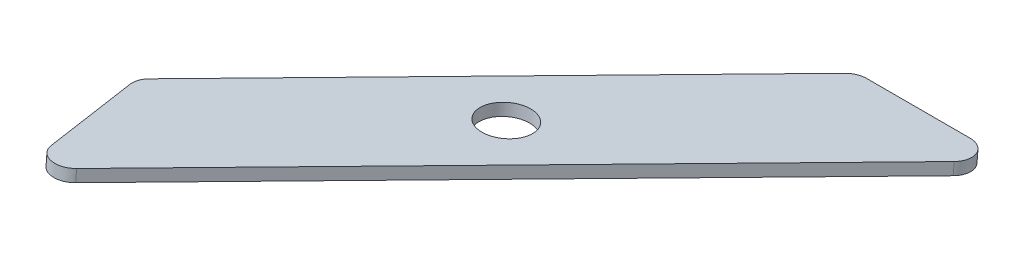
ISO-10303-21;
HEADER;
FILE_DESCRIPTION(('STEP AP214'),'2;1');
FILE_NAME('part.step','',(''),(''),'','','');
FILE_SCHEMA(('AUTOMOTIVE_DESIGN { 1 0 10303 214 1 1 1 1 }'));
ENDSEC;
DATA;
#1=APPLICATION_CONTEXT('core data for automotive mechanical design processes');
#2=APPLICATION_PROTOCOL_DEFINITION('international standard','automotive_design',2000,#1);
#3=PRODUCT_CONTEXT('',#1,'mechanical');
#4=PRODUCT('Part','Part','',(#3));
#5=PRODUCT_RELATED_PRODUCT_CATEGORY('part','',(#4));
#6=PRODUCT_DEFINITION_FORMATION('','',#4);
#7=PRODUCT_DEFINITION_CONTEXT('part definition',#1,'design');
#8=PRODUCT_DEFINITION('design','',#6,#7);
#9=PRODUCT_DEFINITION_SHAPE('','',#8);
#10=(LENGTH_UNIT() NAMED_UNIT(*) SI_UNIT(.MILLI.,.METRE.));
#11=(NAMED_UNIT(*) PLANE_ANGLE_UNIT() SI_UNIT($,.RADIAN.));
#12=(NAMED_UNIT(*) SI_UNIT($,.STERADIAN.) SOLID_ANGLE_UNIT());
#13=UNCERTAINTY_MEASURE_WITH_UNIT(LENGTH_MEASURE(1.E-05),#10,'distance_accuracy_value','');
#14=(GEOMETRIC_REPRESENTATION_CONTEXT(3) GLOBAL_UNCERTAINTY_ASSIGNED_CONTEXT((#13)) GLOBAL_UNIT_ASSIGNED_CONTEXT((#10,
#11,#12)) REPRESENTATION_CONTEXT('',''));
#15=CARTESIAN_POINT('',(0.,0.,0.));
#16=DIRECTION('',(0.,0.,1.));
#17=DIRECTION('',(1.,0.,0.));
#18=AXIS2_PLACEMENT_3D('',#15,#16,#17);
#19=CARTESIAN_POINT('',(-7.13645297293957E-13,53.778197883597,-4.47708887821372));
#20=DIRECTION('',(0.,0.996552545023082,-0.0829639982644206));
#21=DIRECTION('',(0.,0.0829639982644207,0.996552545023082));
#22=AXIS2_PLACEMENT_3D('',#19,#20,#21);
#23=PLANE('',#22);
#24=DIRECTION('',(0.62740953579409,-0.0646031909695749,-0.776004962684642));
#25=VECTOR('',#24,1.);
#26=CARTESIAN_POINT('',(-319.072942794247,61.1309245679556,83.8428889850427));
#27=LINE('',#26,#25);
#28=CARTESIAN_POINT('',(-318.31042098198,61.0524091176063,82.8997718076391));
#29=VERTEX_POINT('',#28);
#30=CARTESIAN_POINT('',(-276.697051927991,56.7675580362792,31.4307088469496));
#31=VERTEX_POINT('',#30);
#32=EDGE_CURVE('E141',#29,#31,#27,.T.);
#33=ORIENTED_EDGE('',*,*,#32,.T.);
#34=CARTESIAN_POINT('',(-274.719180700766,56.8997711415215,33.0188351339046));
#35=DIRECTION('',(0.,0.996552545023082,-0.0829639982644206));
#36=DIRECTION('',(0.,0.0829639982644207,0.996552545023082));
#37=AXIS2_PLACEMENT_3D('',#34,#35,#36);
#38=CIRCLE('',#37,2.54);
#39=CARTESIAN_POINT('',(-274.719180700766,56.6890425859299,30.487591669546));
#40=VERTEX_POINT('',#39);
#41=EDGE_CURVE('E160',#31,#40,#38,.F.);
#42=ORIENTED_EDGE('',*,*,#41,.T.);
#43=DIRECTION('',(1.,0.,0.));
#44=VECTOR('',#43,1.);
#45=CARTESIAN_POINT('',(-275.934530115724,56.6890425859298,30.487591669546));
#46=LINE('',#45,#44);
#47=CARTESIAN_POINT('',(-260.856144714105,56.68904258593,30.487591669546));
#48=VERTEX_POINT('',#47);
#49=EDGE_CURVE('E124',#40,#48,#46,.T.);
#50=ORIENTED_EDGE('',*,*,#49,.T.);
#51=CARTESIAN_POINT('',(-260.856144714105,56.8997711415217,33.0188351339046));
#52=DIRECTION('',(0.,0.996552545023082,-0.0829639982644206));
#53=DIRECTION('',(0.,0.0829639982644207,0.996552545023082));
#54=AXIS2_PLACEMENT_3D('',#51,#52,#53);
#55=CIRCLE('',#54,2.54);
#56=CARTESIAN_POINT('',(-258.878273486881,57.031984246764,34.6069614208597));
#57=VERTEX_POINT('',#56);
#58=EDGE_CURVE('E158',#48,#57,#55,.F.);
#59=ORIENTED_EDGE('',*,*,#58,.T.);
#60=DIRECTION('',(-0.627409535794091,0.0646031909695749,0.776004962684641));
#61=VECTOR('',#60,1.);
#62=CARTESIAN_POINT('',(-255.547712488283,56.6890425859301,30.4875916695459));
#63=LINE('',#62,#61);
#64=CARTESIAN_POINT('',(-311.405809082778,62.4406467226506,99.5750978206675));
#65=VERTEX_POINT('',#64);
#66=EDGE_CURVE('E180',#57,#65,#63,.T.);
#67=ORIENTED_EDGE('',*,*,#66,.T.);
#68=CARTESIAN_POINT('',(-313.383680310003,62.3084336174082,97.9869715337124));
#69=DIRECTION('',(0.,0.996552545023082,-0.0829639982644206));
#70=DIRECTION('',(0.,0.0829639982644207,0.996552545023082));
#71=AXIS2_PLACEMENT_3D('',#68,#69,#70);
#72=CIRCLE('',#71,2.54);
#73=CARTESIAN_POINT('',(-315.86555084707,62.3532586470279,98.5254038451092));
#74=VERTEX_POINT('',#73);
#75=EDGE_CURVE('E59',#65,#74,#72,.F.);
#76=ORIENTED_EDGE('',*,*,#75,.T.);
#77=DIRECTION('',(-0.212714548789279,-0.0810653161140894,-0.973745826823764));
#78=VECTOR('',#77,1.);
#79=CARTESIAN_POINT('',(-314.736370081376,62.7835883834845,103.694467571981));
#80=LINE('',#79,#78);
#81=CARTESIAN_POINT('',(-318.814420291822,61.2294472524683,85.0263304059911));
#82=VERTEX_POINT('',#81);
#83=EDGE_CURVE('E170',#74,#82,#80,.T.);
#84=ORIENTED_EDGE('',*,*,#83,.T.);
#85=CARTESIAN_POINT('',(-316.332549754755,61.1846222228486,84.4878980945942));
#86=DIRECTION('',(0.,0.996552545023082,-0.0829639982644206));
#87=DIRECTION('',(0.,0.0829639982644207,0.996552545023082));
#88=AXIS2_PLACEMENT_3D('',#85,#86,#87);
#89=CIRCLE('',#88,2.54);
#90=EDGE_CURVE('E156',#82,#29,#89,.F.);
#91=ORIENTED_EDGE('',*,*,#90,.T.);
#92=EDGE_LOOP('',(#33,#42,#50,#59,#67,#76,#84,#91));
#93=FACE_BOUND('',#92,.T.);
#94=CARTESIAN_POINT('',(-291.322888869907,59.323149530825,62.1281349740289));
#95=DIRECTION('',(0.,-0.996552545023082,0.0829639982644206));
#96=DIRECTION('',(0.,-0.0829639982644206,-0.996552545023082));
#97=AXIS2_PLACEMENT_3D('',#94,#95,#96);
#98=CIRCLE('',#97,3.26390000000006);
#99=CARTESIAN_POINT('',(-291.322888869907,59.5939357247602,65.3807828257298));
#100=VERTEX_POINT('',#99);
#101=EDGE_CURVE('E132',#100,#100,#98,.T.);
#102=ORIENTED_EDGE('',*,*,#101,.F.);
#103=EDGE_LOOP('',(#102));
#104=FACE_BOUND('',#103,.T.);
#105=ADVANCED_FACE('F39',(#93,#104),#23,.F.);
#106=CARTESIAN_POINT('',(-7.34839107889356E-13,55.3602250488212,-4.60879422545849));
#107=DIRECTION('',(0.,0.996552545023082,-0.0829639982644206));
#108=DIRECTION('',(0.,0.0829639982644207,0.996552545023082));
#109=AXIS2_PLACEMENT_3D('',#106,#107,#108);
#110=PLANE('',#109);
#111=DIRECTION('',(1.,0.,0.));
#112=VECTOR('',#111,1.);
#113=CARTESIAN_POINT('',(-275.934530115724,58.271069751154,30.3558863223013));
#114=LINE('',#113,#112);
#115=CARTESIAN_POINT('',(-274.719180700766,58.271069751154,30.3558863223012));
#116=VERTEX_POINT('',#115);
#117=CARTESIAN_POINT('',(-260.856144714105,58.2710697511542,30.3558863223012));
#118=VERTEX_POINT('',#117);
#119=EDGE_CURVE('E121',#116,#118,#114,.T.);
#120=ORIENTED_EDGE('',*,*,#119,.F.);
#121=CARTESIAN_POINT('',(-274.719180700766,58.4817983067456,32.8871297866599));
#122=DIRECTION('',(0.,0.996552545023082,-0.0829639982644206));
#123=DIRECTION('',(0.,0.0829639982644207,0.996552545023082));
#124=AXIS2_PLACEMENT_3D('',#121,#122,#123);
#125=CIRCLE('',#124,2.54);
#126=CARTESIAN_POINT('',(-276.697051927991,58.3495852015033,31.2990034997048));
#127=VERTEX_POINT('',#126);
#128=EDGE_CURVE('E104',#116,#127,#125,.T.);
#129=ORIENTED_EDGE('',*,*,#128,.T.);
#130=DIRECTION('',(0.62740953579409,-0.0646031909695749,-0.776004962684642));
#131=VECTOR('',#130,1.);
#132=CARTESIAN_POINT('',(-319.072942794247,62.7129517331797,83.7111836377979));
#133=LINE('',#132,#131);
#134=CARTESIAN_POINT('',(-318.31042098198,62.6344362828304,82.7680664603944));
#135=VERTEX_POINT('',#134);
#136=EDGE_CURVE('E145',#135,#127,#133,.T.);
#137=ORIENTED_EDGE('',*,*,#136,.F.);
#138=CARTESIAN_POINT('',(-316.332549754755,62.7666493880728,84.3561927473495));
#139=DIRECTION('',(0.,0.996552545023082,-0.0829639982644206));
#140=DIRECTION('',(0.,0.0829639982644207,0.996552545023082));
#141=AXIS2_PLACEMENT_3D('',#138,#139,#140);
#142=CIRCLE('',#141,2.54);
#143=CARTESIAN_POINT('',(-318.814420291822,62.8114744176924,84.8946250587463));
#144=VERTEX_POINT('',#143);
#145=EDGE_CURVE('E149',#135,#144,#142,.T.);
#146=ORIENTED_EDGE('',*,*,#145,.T.);
#147=DIRECTION('',(-0.212714548789279,-0.0810653161140894,-0.973745826823764));
#148=VECTOR('',#147,1.);
#149=CARTESIAN_POINT('',(-314.736370081376,64.3656155487086,103.562762224736));
#150=LINE('',#149,#148);
#151=CARTESIAN_POINT('',(-315.86555084707,63.935285812252,98.3936984978645));
#152=VERTEX_POINT('',#151);
#153=EDGE_CURVE('E135',#152,#144,#150,.T.);
#154=ORIENTED_EDGE('',*,*,#153,.F.);
#155=CARTESIAN_POINT('',(-313.383680310003,63.8904607826324,97.8552661864676));
#156=DIRECTION('',(0.,0.996552545023082,-0.0829639982644206));
#157=DIRECTION('',(0.,0.0829639982644207,0.996552545023082));
#158=AXIS2_PLACEMENT_3D('',#155,#156,#157);
#159=CIRCLE('',#158,2.54);
#160=CARTESIAN_POINT('',(-311.405809082778,64.0226738878747,99.4433924734227));
#161=VERTEX_POINT('',#160);
#162=EDGE_CURVE('E125',#152,#161,#159,.T.);
#163=ORIENTED_EDGE('',*,*,#162,.T.);
#164=DIRECTION('',(-0.627409535794091,0.0646031909695749,0.776004962684641));
#165=VECTOR('',#164,1.);
#166=CARTESIAN_POINT('',(-255.547712488283,58.2710697511543,30.3558863223012));
#167=LINE('',#166,#165);
#168=CARTESIAN_POINT('',(-258.878273486881,58.6140114119881,34.4752560736149));
#169=VERTEX_POINT('',#168);
#170=EDGE_CURVE('E131',#169,#161,#167,.T.);
#171=ORIENTED_EDGE('',*,*,#170,.F.);
#172=CARTESIAN_POINT('',(-260.856144714105,58.4817983067458,32.8871297866598));
#173=DIRECTION('',(0.,0.996552545023082,-0.0829639982644206));
#174=DIRECTION('',(0.,0.0829639982644207,0.996552545023082));
#175=AXIS2_PLACEMENT_3D('',#172,#173,#174);
#176=CIRCLE('',#175,2.54);
#177=EDGE_CURVE('E115',#169,#118,#176,.T.);
#178=ORIENTED_EDGE('',*,*,#177,.T.);
#179=EDGE_LOOP('',(#120,#129,#137,#146,#154,#163,#171,#178));
#180=FACE_BOUND('',#179,.T.);
#181=CARTESIAN_POINT('',(-291.322888869907,60.9051766960491,61.9964296267842));
#182=DIRECTION('',(0.,-0.996552545023082,0.0829639982644206));
#183=DIRECTION('',(0.,-0.0829639982644206,-0.996552545023082));
#184=AXIS2_PLACEMENT_3D('',#181,#182,#183);
#185=CIRCLE('',#184,3.26390000000006);
#186=CARTESIAN_POINT('',(-291.322888869907,61.1759628899844,65.2490774784851));
#187=VERTEX_POINT('',#186);
#188=EDGE_CURVE('E138',#187,#187,#185,.T.);
#189=ORIENTED_EDGE('',*,*,#188,.T.);
#190=EDGE_LOOP('',(#189));
#191=FACE_BOUND('',#190,.T.);
#192=ADVANCED_FACE('F128',(#180,#191),#110,.T.);
#193=CARTESIAN_POINT('',(-275.934530115724,56.6890425859298,30.487591669546));
#194=DIRECTION('',(0.,0.0829639982644206,0.996552545023082));
#195=DIRECTION('',(0.,-0.996552545023082,0.0829639982644206));
#196=AXIS2_PLACEMENT_3D('',#193,#194,#195);
#197=PLANE('',#196);
#198=ORIENTED_EDGE('',*,*,#49,.F.);
#199=DIRECTION('',(0.,0.996552545023082,-0.0829639982644206));
#200=VECTOR('',#199,1.);
#201=CARTESIAN_POINT('',(-274.719180700766,56.6890425859299,30.487591669546));
#202=LINE('',#201,#200);
#203=EDGE_CURVE('E108',#40,#116,#202,.T.);
#204=ORIENTED_EDGE('',*,*,#203,.T.);
#205=ORIENTED_EDGE('',*,*,#119,.T.);
#206=DIRECTION('',(0.,0.996552545023082,-0.0829639982644206));
#207=VECTOR('',#206,1.);
#208=CARTESIAN_POINT('',(-260.856144714105,56.68904258593,30.487591669546));
#209=LINE('',#208,#207);
#210=EDGE_CURVE('E126',#118,#48,#209,.F.);
#211=ORIENTED_EDGE('',*,*,#210,.T.);
#212=EDGE_LOOP('',(#198,#204,#205,#211));
#213=FACE_BOUND('',#212,.T.);
#214=ADVANCED_FACE('F120',(#213),#197,.F.);
#215=CARTESIAN_POINT('',(-255.547712488283,56.6890425859301,30.4875916695459));
#216=DIRECTION('',(-0.778689459537397,-0.0520524036387122,-0.625246569667351));
#217=DIRECTION('',(-0.626095332830915,0.,0.779746519201815));
#218=AXIS2_PLACEMENT_3D('',#215,#216,#217);
#219=PLANE('',#218);
#220=ORIENTED_EDGE('',*,*,#66,.F.);
#221=DIRECTION('',(0.,0.996552545023082,-0.0829639982644206));
#222=VECTOR('',#221,1.);
#223=CARTESIAN_POINT('',(-258.878273486881,57.031984246764,34.6069614208597));
#224=LINE('',#223,#222);
#225=EDGE_CURVE('E164',#57,#169,#224,.T.);
#226=ORIENTED_EDGE('',*,*,#225,.T.);
#227=ORIENTED_EDGE('',*,*,#170,.T.);
#228=DIRECTION('',(0.,0.996552545023082,-0.0829639982644206));
#229=VECTOR('',#228,1.);
#230=CARTESIAN_POINT('',(-311.405809082778,62.4406467226506,99.5750978206675));
#231=LINE('',#230,#229);
#232=EDGE_CURVE('E162',#161,#65,#231,.F.);
#233=ORIENTED_EDGE('',*,*,#232,.T.);
#234=EDGE_LOOP('',(#220,#226,#227,#233));
#235=FACE_BOUND('',#234,.T.);
#236=ADVANCED_FACE('F208',(#235),#219,.F.);
#237=CARTESIAN_POINT('',(-314.736370081376,62.7835883834845,103.694467571981));
#238=DIRECTION('',(0.977114384672221,-0.0176476494565577,-0.211981224959394));
#239=DIRECTION('',(-0.212014242338459,0.,-0.977266576245013));
#240=AXIS2_PLACEMENT_3D('',#237,#238,#239);
#241=PLANE('',#240);
#242=ORIENTED_EDGE('',*,*,#153,.T.);
#243=DIRECTION('',(0.,0.996552545023082,-0.0829639982644206));
#244=VECTOR('',#243,1.);
#245=CARTESIAN_POINT('',(-318.814420291822,61.2294472524683,85.0263304059911));
#246=LINE('',#245,#244);
#247=EDGE_CURVE('E11',#144,#82,#246,.F.);
#248=ORIENTED_EDGE('',*,*,#247,.T.);
#249=ORIENTED_EDGE('',*,*,#83,.F.);
#250=DIRECTION('',(0.,0.996552545023082,-0.0829639982644206));
#251=VECTOR('',#250,1.);
#252=CARTESIAN_POINT('',(-315.86555084707,62.3532586470279,98.5254038451092));
#253=LINE('',#252,#251);
#254=EDGE_CURVE('E47',#74,#152,#253,.T.);
#255=ORIENTED_EDGE('',*,*,#254,.T.);
#256=EDGE_LOOP('',(#242,#248,#249,#255));
#257=FACE_BOUND('',#256,.T.);
#258=ADVANCED_FACE('F169',(#257),#241,.F.);
#259=CARTESIAN_POINT('',(-319.072942794247,61.1309245679556,83.8428889850427));
#260=DIRECTION('',(0.778689459537398,0.0520524036387122,0.62524656966735));
#261=DIRECTION('',(0.626095332830914,0.,-0.779746519201815));
#262=AXIS2_PLACEMENT_3D('',#259,#260,#261);
#263=PLANE('',#262);
#264=ORIENTED_EDGE('',*,*,#136,.T.);
#265=DIRECTION('',(0.,0.996552545023082,-0.0829639982644206));
#266=VECTOR('',#265,1.);
#267=CARTESIAN_POINT('',(-276.697051927991,56.7675580362792,31.4307088469496));
#268=LINE('',#267,#266);
#269=EDGE_CURVE('E109',#127,#31,#268,.F.);
#270=ORIENTED_EDGE('',*,*,#269,.T.);
#271=ORIENTED_EDGE('',*,*,#32,.F.);
#272=DIRECTION('',(0.,0.996552545023082,-0.0829639982644206));
#273=VECTOR('',#272,1.);
#274=CARTESIAN_POINT('',(-318.31042098198,61.0524091176063,82.8997718076391));
#275=LINE('',#274,#273);
#276=EDGE_CURVE('E114',#29,#135,#275,.T.);
#277=ORIENTED_EDGE('',*,*,#276,.T.);
#278=EDGE_LOOP('',(#264,#270,#271,#277));
#279=FACE_BOUND('',#278,.T.);
#280=ADVANCED_FACE('F178',(#279),#263,.F.);
#281=CARTESIAN_POINT('',(-291.322888869907,59.323149530825,62.1281349740289));
#282=DIRECTION('',(0.,0.996552545023082,-0.0829639982644206));
#283=DIRECTION('',(0.,0.0829639982644206,0.996552545023082));
#284=AXIS2_PLACEMENT_3D('',#281,#282,#283);
#285=CYLINDRICAL_SURFACE('',#284,3.26390000000006);
#286=CARTESIAN_POINT('',(-291.322888869907,59.5939357247602,65.3807828257298));
#287=CARTESIAN_POINT('',(-291.322888869907,59.610415174398,65.3794108950294));
#288=CARTESIAN_POINT('',(-291.322888869907,59.6268946240358,65.3780389643289));
#289=CARTESIAN_POINT('',(-291.322888869907,59.6598535233113,65.375295102928));
#290=CARTESIAN_POINT('',(-291.322888869907,59.676332972949,65.3739231722275));
#291=CARTESIAN_POINT('',(-291.322888869907,59.7092918722245,65.3711793108266));
#292=CARTESIAN_POINT('',(-291.322888869907,59.7257713218623,65.3698073801261));
#293=CARTESIAN_POINT('',(-291.322888869907,59.7587302211378,65.3670635187252));
#294=CARTESIAN_POINT('',(-291.322888869907,59.7752096707755,65.3656915880247));
#295=CARTESIAN_POINT('',(-291.322888869907,59.808168570051,65.3629477266238));
#296=CARTESIAN_POINT('',(-291.322888869907,59.8246480196888,65.3615757959233));
#297=CARTESIAN_POINT('',(-291.322888869907,59.8576069189643,65.3588319345224));
#298=CARTESIAN_POINT('',(-291.322888869907,59.874086368602,65.3574600038219));
#299=CARTESIAN_POINT('',(-291.322888869907,59.9070452678775,65.354716142421));
#300=CARTESIAN_POINT('',(-291.322888869907,59.9235247175153,65.3533442117205));
#301=CARTESIAN_POINT('',(-291.322888869907,59.9564836167908,65.3506003503196));
#302=CARTESIAN_POINT('',(-291.322888869907,59.9729630664285,65.3492284196191));
#303=CARTESIAN_POINT('',(-291.322888869907,60.005921965704,65.3464845582182));
#304=CARTESIAN_POINT('',(-291.322888869907,60.0224014153418,65.3451126275177));
#305=CARTESIAN_POINT('',(-291.322888869907,60.0553603146173,65.3423687661168));
#306=CARTESIAN_POINT('',(-291.322888869907,60.071839764255,65.3409968354163));
#307=CARTESIAN_POINT('',(-291.322888869907,60.1047986635305,65.3382529740154));
#308=CARTESIAN_POINT('',(-291.322888869907,60.1212781131683,65.3368810433149));
#309=CARTESIAN_POINT('',(-291.322888869907,60.1542370124438,65.334137181914));
#310=CARTESIAN_POINT('',(-291.322888869907,60.1707164620816,65.3327652512135));
#311=CARTESIAN_POINT('',(-291.322888869907,60.2036753613571,65.3300213898126));
#312=CARTESIAN_POINT('',(-291.322888869907,60.2201548109948,65.3286494591121));
#313=CARTESIAN_POINT('',(-291.322888869907,60.2531137102703,65.3259055977112));
#314=CARTESIAN_POINT('',(-291.322888869907,60.2695931599081,65.3245336670107));
#315=CARTESIAN_POINT('',(-291.322888869907,60.3025520591836,65.3217898056098));
#316=CARTESIAN_POINT('',(-291.322888869907,60.3190315088213,65.3204178749093));
#317=CARTESIAN_POINT('',(-291.322888869907,60.3519904080968,65.3176740135084));
#318=CARTESIAN_POINT('',(-291.322888869907,60.3684698577346,65.3163020828079));
#319=CARTESIAN_POINT('',(-291.322888869907,60.4014287570101,65.313558221407));
#320=CARTESIAN_POINT('',(-291.322888869907,60.4179082066478,65.3121862907065));
#321=CARTESIAN_POINT('',(-291.322888869907,60.4508671059233,65.3094424293056));
#322=CARTESIAN_POINT('',(-291.322888869907,60.4673465555611,65.3080704986051));
#323=CARTESIAN_POINT('',(-291.322888869907,60.5003054548366,65.3053266372042));
#324=CARTESIAN_POINT('',(-291.322888869907,60.5167849044743,65.3039547065037));
#325=CARTESIAN_POINT('',(-291.322888869907,60.5497438037498,65.3012108451028));
#326=CARTESIAN_POINT('',(-291.322888869907,60.5662232533876,65.2998389144023));
#327=CARTESIAN_POINT('',(-291.322888869907,60.5991821526631,65.2970950530014));
#328=CARTESIAN_POINT('',(-291.322888869907,60.6156616023008,65.2957231223009));
#329=CARTESIAN_POINT('',(-291.322888869907,60.6486205015763,65.2929792609));
#330=CARTESIAN_POINT('',(-291.322888869907,60.6650999512141,65.2916073301995));
#331=CARTESIAN_POINT('',(-291.322888869907,60.6980588504896,65.2888634687986));
#332=CARTESIAN_POINT('',(-291.322888869907,60.7145383001274,65.2874915380981));
#333=CARTESIAN_POINT('',(-291.322888869907,60.7474971994029,65.2847476766972));
#334=CARTESIAN_POINT('',(-291.322888869907,60.7639766490406,65.2833757459967));
#335=CARTESIAN_POINT('',(-291.322888869907,60.7969355483161,65.2806318845958));
#336=CARTESIAN_POINT('',(-291.322888869907,60.8134149979539,65.2792599538953));
#337=CARTESIAN_POINT('',(-291.322888869907,60.8463738972294,65.2765160924944));
#338=CARTESIAN_POINT('',(-291.322888869907,60.8628533468671,65.2751441617939));
#339=CARTESIAN_POINT('',(-291.322888869907,60.8958122461426,65.272400300393));
#340=CARTESIAN_POINT('',(-291.322888869907,60.9122916957804,65.2710283696925));
#341=CARTESIAN_POINT('',(-291.322888869907,60.9452505950559,65.2682845082916));
#342=CARTESIAN_POINT('',(-291.322888869907,60.9617300446936,65.2669125775911));
#343=CARTESIAN_POINT('',(-291.322888869907,60.9946889439691,65.2641687161902));
#344=CARTESIAN_POINT('',(-291.322888869907,61.0111683936069,65.2627967854897));
#345=CARTESIAN_POINT('',(-291.322888869907,61.0441272928824,65.2600529240888));
#346=CARTESIAN_POINT('',(-291.322888869907,61.0606067425201,65.2586809933883));
#347=CARTESIAN_POINT('',(-291.322888869907,61.0935656417956,65.2559371319874));
#348=CARTESIAN_POINT('',(-291.322888869907,61.1100450914334,65.2545652012869));
#349=CARTESIAN_POINT('',(-291.322888869907,61.1430039907089,65.251821339886));
#350=CARTESIAN_POINT('',(-291.322888869907,61.1594834403466,65.2504494091855));
#351=CARTESIAN_POINT('',(-291.322888869907,61.1759628899844,65.2490774784851));
#352=B_SPLINE_CURVE_WITH_KNOTS('',3,(#286,#287,#288,#289,#290,#291,#292,#293,#294,#295,#296,
#297,#298,#299,#300,#301,#302,#303,#304,#305,#306,#307,#308,#309,#310,#311,#312,#313,#314,#315,
#316,#317,#318,#319,#320,#321,#322,#323,#324,#325,#326,#327,#328,#329,#330,#331,#332,#333,#334,
#335,#336,#337,#338,#339,#340,#341,#342,#343,#344,#345,#346,#347,#348,#349,#350,#351),
.UNSPECIFIED.,.F.,.F.,(4,2,2,2,2,2,2,2,2,2,2,2,2,2,2,2,2,2,2,2,2,2,2,2,2,2,2,2,2,2,2,2,4),(0.,
0.0496093750000037,0.0992187500000004,0.148828125000004,0.198437500000001,0.248046875000006,
0.297656250000002,0.347265625000006,0.396875000000003,0.446484375,0.496093750000003,0.545703125,
0.595312500000004,0.644921875000002,0.694531250000005,0.744140625000002,0.793749999999999,
0.843359375000003,0.892968749999999,0.942578125000003,0.9921875,1.041796875,1.09140625,
1.141015625,1.190625,1.240234375,1.28984375,1.339453125,1.3890625,1.438671875,1.48828125,
1.537890625,1.5875),.UNSPECIFIED.);
#353=EDGE_CURVE('BSEAM187',#100,#187,#352,.T.);
#354=ORIENTED_EDGE('',*,*,#101,.T.);
#355=ORIENTED_EDGE('',*,*,#188,.F.);
#356=ORIENTED_EDGE('',*,*,#353,.T.);
#357=ORIENTED_EDGE('',*,*,#353,.F.);
#358=EDGE_LOOP('',(#354,#356,#355,#357));
#359=FACE_BOUND('',#358,.T.);
#360=ADVANCED_FACE('F187',(#359),#285,.F.);
#361=CARTESIAN_POINT('',(-274.719180700766,56.8997711415215,33.0188351339046));
#362=DIRECTION('',(0.,0.996552545023082,-0.0829639982644206));
#363=DIRECTION('',(0.,0.0829639982644206,0.996552545023082));
#364=AXIS2_PLACEMENT_3D('',#361,#362,#363);
#365=CYLINDRICAL_SURFACE('',#364,2.54);
#366=ORIENTED_EDGE('',*,*,#41,.F.);
#367=ORIENTED_EDGE('',*,*,#269,.F.);
#368=ORIENTED_EDGE('',*,*,#128,.F.);
#369=ORIENTED_EDGE('',*,*,#203,.F.);
#370=EDGE_LOOP('',(#366,#367,#368,#369));
#371=FACE_BOUND('',#370,.T.);
#372=ADVANCED_FACE('F107',(#371),#365,.T.);
#373=CARTESIAN_POINT('',(-260.856144714105,56.8997711415217,33.0188351339046));
#374=DIRECTION('',(0.,0.996552545023082,-0.0829639982644206));
#375=DIRECTION('',(0.,0.0829639982644206,0.996552545023082));
#376=AXIS2_PLACEMENT_3D('',#373,#374,#375);
#377=CYLINDRICAL_SURFACE('',#376,2.54);
#378=ORIENTED_EDGE('',*,*,#58,.F.);
#379=ORIENTED_EDGE('',*,*,#210,.F.);
#380=ORIENTED_EDGE('',*,*,#177,.F.);
#381=ORIENTED_EDGE('',*,*,#225,.F.);
#382=EDGE_LOOP('',(#378,#379,#380,#381));
#383=FACE_BOUND('',#382,.T.);
#384=ADVANCED_FACE('F195',(#383),#377,.T.);
#385=CARTESIAN_POINT('',(-316.332549754755,61.1846222228486,84.4878980945942));
#386=DIRECTION('',(0.,0.996552545023082,-0.0829639982644206));
#387=DIRECTION('',(0.,0.0829639982644206,0.996552545023082));
#388=AXIS2_PLACEMENT_3D('',#385,#386,#387);
#389=CYLINDRICAL_SURFACE('',#388,2.54);
#390=ORIENTED_EDGE('',*,*,#90,.F.);
#391=ORIENTED_EDGE('',*,*,#247,.F.);
#392=ORIENTED_EDGE('',*,*,#145,.F.);
#393=ORIENTED_EDGE('',*,*,#276,.F.);
#394=EDGE_LOOP('',(#390,#391,#392,#393));
#395=FACE_BOUND('',#394,.T.);
#396=ADVANCED_FACE('F175',(#395),#389,.T.);
#397=CARTESIAN_POINT('',(-313.383680310003,62.3084336174082,97.9869715337124));
#398=DIRECTION('',(0.,0.996552545023082,-0.0829639982644206));
#399=DIRECTION('',(0.,0.0829639982644206,0.996552545023082));
#400=AXIS2_PLACEMENT_3D('',#397,#398,#399);
#401=CYLINDRICAL_SURFACE('',#400,2.54);
#402=ORIENTED_EDGE('',*,*,#75,.F.);
#403=ORIENTED_EDGE('',*,*,#232,.F.);
#404=ORIENTED_EDGE('',*,*,#162,.F.);
#405=ORIENTED_EDGE('',*,*,#254,.F.);
#406=EDGE_LOOP('',(#402,#403,#404,#405));
#407=FACE_BOUND('',#406,.T.);
#408=ADVANCED_FACE('F41',(#407),#401,.T.);
#409=CLOSED_SHELL('',(#105,#192,#214,#236,#258,#280,#360,#372,#384,#396,#408));
#410=MANIFOLD_SOLID_BREP('B2',#409);
#411=ADVANCED_BREP_SHAPE_REPRESENTATION('',(#18,#410),#14);
#412=SHAPE_DEFINITION_REPRESENTATION(#9,#411);
ENDSEC;
END-ISO-10303-21;
